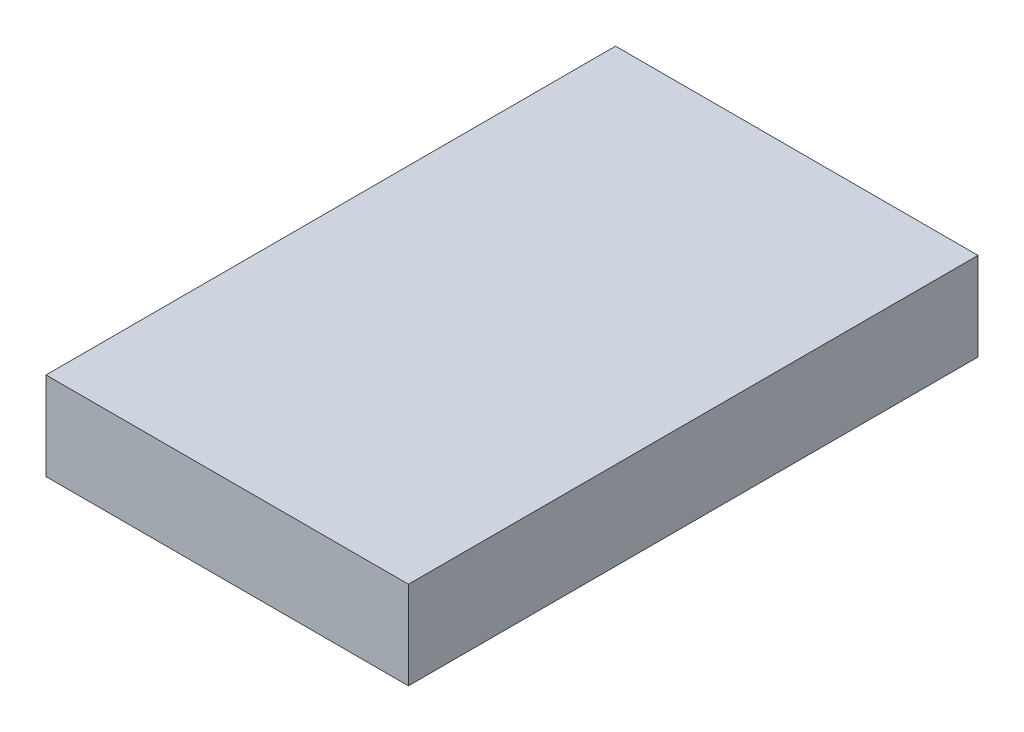
ISO-10303-21;
HEADER;
FILE_DESCRIPTION(('STEP AP214'),'2;1');
FILE_NAME('part.step','',(''),(''),'','','');
FILE_SCHEMA(('AUTOMOTIVE_DESIGN { 1 0 10303 214 1 1 1 1 }'));
ENDSEC;
DATA;
#1=APPLICATION_CONTEXT('core data for automotive mechanical design processes');
#2=APPLICATION_PROTOCOL_DEFINITION('international standard','automotive_design',2000,#1);
#3=PRODUCT_CONTEXT('',#1,'mechanical');
#4=PRODUCT('Part','Part','',(#3));
#5=PRODUCT_RELATED_PRODUCT_CATEGORY('part','',(#4));
#6=PRODUCT_DEFINITION_FORMATION('','',#4);
#7=PRODUCT_DEFINITION_CONTEXT('part definition',#1,'design');
#8=PRODUCT_DEFINITION('design','',#6,#7);
#9=PRODUCT_DEFINITION_SHAPE('','',#8);
#10=(LENGTH_UNIT() NAMED_UNIT(*) SI_UNIT(.MILLI.,.METRE.));
#11=(NAMED_UNIT(*) PLANE_ANGLE_UNIT() SI_UNIT($,.RADIAN.));
#12=(NAMED_UNIT(*) SI_UNIT($,.STERADIAN.) SOLID_ANGLE_UNIT());
#13=UNCERTAINTY_MEASURE_WITH_UNIT(LENGTH_MEASURE(1.E-05),#10,'distance_accuracy_value','');
#14=(GEOMETRIC_REPRESENTATION_CONTEXT(3) GLOBAL_UNCERTAINTY_ASSIGNED_CONTEXT((#13)) GLOBAL_UNIT_ASSIGNED_CONTEXT((#10,
#11,#12)) REPRESENTATION_CONTEXT('',''));
#15=CARTESIAN_POINT('',(0.,0.,0.));
#16=DIRECTION('',(0.,0.,1.));
#17=DIRECTION('',(1.,0.,0.));
#18=AXIS2_PLACEMENT_3D('',#15,#16,#17);
#19=CARTESIAN_POINT('',(70.,0.,-110.));
#20=DIRECTION('',(0.,0.,-1.));
#21=DIRECTION('',(-1.,0.,0.));
#22=AXIS2_PLACEMENT_3D('',#19,#20,#21);
#23=PLANE('',#22);
#24=DIRECTION('',(-1.,0.,0.));
#25=VECTOR('',#24,1.);
#26=CARTESIAN_POINT('',(70.,17.,-110.));
#27=LINE('',#26,#25);
#28=CARTESIAN_POINT('',(70.,17.,-110.));
#29=VERTEX_POINT('',#28);
#30=CARTESIAN_POINT('',(0.,17.,-110.));
#31=VERTEX_POINT('',#30);
#32=EDGE_CURVE('E96',#29,#31,#27,.T.);
#33=ORIENTED_EDGE('',*,*,#32,.F.);
#34=DIRECTION('',(0.,1.,0.));
#35=VECTOR('',#34,1.);
#36=CARTESIAN_POINT('',(70.,0.,-110.));
#37=LINE('',#36,#35);
#38=CARTESIAN_POINT('',(70.,0.,-110.));
#39=VERTEX_POINT('',#38);
#40=EDGE_CURVE('E11',#39,#29,#37,.T.);
#41=ORIENTED_EDGE('',*,*,#40,.F.);
#42=DIRECTION('',(-1.,0.,0.));
#43=VECTOR('',#42,1.);
#44=CARTESIAN_POINT('',(70.,0.,-110.));
#45=LINE('',#44,#43);
#46=CARTESIAN_POINT('',(0.,0.,-110.));
#47=VERTEX_POINT('',#46);
#48=EDGE_CURVE('E90',#39,#47,#45,.T.);
#49=ORIENTED_EDGE('',*,*,#48,.T.);
#50=DIRECTION('',(0.,1.,0.));
#51=VECTOR('',#50,1.);
#52=CARTESIAN_POINT('',(0.,0.,-110.));
#53=LINE('',#52,#51);
#54=EDGE_CURVE('E35',#47,#31,#53,.T.);
#55=ORIENTED_EDGE('',*,*,#54,.T.);
#56=EDGE_LOOP('',(#33,#41,#49,#55));
#57=FACE_BOUND('',#56,.T.);
#58=ADVANCED_FACE('F32',(#57),#23,.T.);
#59=CARTESIAN_POINT('',(70.,0.,0.));
#60=DIRECTION('',(1.,0.,0.));
#61=DIRECTION('',(0.,0.,-1.));
#62=AXIS2_PLACEMENT_3D('',#59,#60,#61);
#63=PLANE('',#62);
#64=DIRECTION('',(0.,0.,-1.));
#65=VECTOR('',#64,1.);
#66=CARTESIAN_POINT('',(70.,17.,0.));
#67=LINE('',#66,#65);
#68=CARTESIAN_POINT('',(70.,17.,0.));
#69=VERTEX_POINT('',#68);
#70=EDGE_CURVE('E92',#69,#29,#67,.T.);
#71=ORIENTED_EDGE('',*,*,#70,.F.);
#72=DIRECTION('',(0.,1.,0.));
#73=VECTOR('',#72,1.);
#74=CARTESIAN_POINT('',(70.,0.,0.));
#75=LINE('',#74,#73);
#76=CARTESIAN_POINT('',(70.,0.,0.));
#77=VERTEX_POINT('',#76);
#78=EDGE_CURVE('E41',#77,#69,#75,.T.);
#79=ORIENTED_EDGE('',*,*,#78,.F.);
#80=DIRECTION('',(0.,0.,-1.));
#81=VECTOR('',#80,1.);
#82=CARTESIAN_POINT('',(70.,0.,0.));
#83=LINE('',#82,#81);
#84=EDGE_CURVE('E87',#77,#39,#83,.T.);
#85=ORIENTED_EDGE('',*,*,#84,.T.);
#86=ORIENTED_EDGE('',*,*,#40,.T.);
#87=EDGE_LOOP('',(#71,#79,#85,#86));
#88=FACE_BOUND('',#87,.T.);
#89=ADVANCED_FACE('F106',(#88),#63,.T.);
#90=CARTESIAN_POINT('',(0.,0.,0.));
#91=DIRECTION('',(0.,0.,1.));
#92=DIRECTION('',(1.,0.,0.));
#93=AXIS2_PLACEMENT_3D('',#90,#91,#92);
#94=PLANE('',#93);
#95=DIRECTION('',(1.,0.,0.));
#96=VECTOR('',#95,1.);
#97=CARTESIAN_POINT('',(0.,17.,0.));
#98=LINE('',#97,#96);
#99=CARTESIAN_POINT('',(0.,17.,0.));
#100=VERTEX_POINT('',#99);
#101=EDGE_CURVE('E82',#100,#69,#98,.T.);
#102=ORIENTED_EDGE('',*,*,#101,.F.);
#103=DIRECTION('',(0.,1.,0.));
#104=VECTOR('',#103,1.);
#105=CARTESIAN_POINT('',(0.,0.,0.));
#106=LINE('',#105,#104);
#107=CARTESIAN_POINT('',(0.,0.,0.));
#108=VERTEX_POINT('',#107);
#109=EDGE_CURVE('E77',#108,#100,#106,.T.);
#110=ORIENTED_EDGE('',*,*,#109,.F.);
#111=DIRECTION('',(1.,0.,0.));
#112=VECTOR('',#111,1.);
#113=CARTESIAN_POINT('',(0.,0.,0.));
#114=LINE('',#113,#112);
#115=EDGE_CURVE('E80',#108,#77,#114,.T.);
#116=ORIENTED_EDGE('',*,*,#115,.T.);
#117=ORIENTED_EDGE('',*,*,#78,.T.);
#118=EDGE_LOOP('',(#102,#110,#116,#117));
#119=FACE_BOUND('',#118,.T.);
#120=ADVANCED_FACE('F79',(#119),#94,.T.);
#121=CARTESIAN_POINT('',(0.,0.,-110.));
#122=DIRECTION('',(-1.,0.,0.));
#123=DIRECTION('',(0.,0.,1.));
#124=AXIS2_PLACEMENT_3D('',#121,#122,#123);
#125=PLANE('',#124);
#126=DIRECTION('',(0.,0.,1.));
#127=VECTOR('',#126,1.);
#128=CARTESIAN_POINT('',(0.,17.,-110.));
#129=LINE('',#128,#127);
#130=EDGE_CURVE('E99',#31,#100,#129,.T.);
#131=ORIENTED_EDGE('',*,*,#130,.F.);
#132=ORIENTED_EDGE('',*,*,#54,.F.);
#133=DIRECTION('',(0.,0.,1.));
#134=VECTOR('',#133,1.);
#135=CARTESIAN_POINT('',(0.,0.,-110.));
#136=LINE('',#135,#134);
#137=EDGE_CURVE('E86',#47,#108,#136,.T.);
#138=ORIENTED_EDGE('',*,*,#137,.T.);
#139=ORIENTED_EDGE('',*,*,#109,.T.);
#140=EDGE_LOOP('',(#131,#132,#138,#139));
#141=FACE_BOUND('',#140,.T.);
#142=ADVANCED_FACE('F89',(#141),#125,.T.);
#143=CARTESIAN_POINT('',(0.,0.,0.));
#144=DIRECTION('',(0.,1.,0.));
#145=DIRECTION('',(0.,0.,1.));
#146=AXIS2_PLACEMENT_3D('',#143,#144,#145);
#147=PLANE('',#146);
#148=ORIENTED_EDGE('',*,*,#48,.F.);
#149=ORIENTED_EDGE('',*,*,#84,.F.);
#150=ORIENTED_EDGE('',*,*,#115,.F.);
#151=ORIENTED_EDGE('',*,*,#137,.F.);
#152=EDGE_LOOP('',(#148,#149,#150,#151));
#153=FACE_BOUND('',#152,.T.);
#154=ADVANCED_FACE('F85',(#153),#147,.F.);
#155=CARTESIAN_POINT('',(0.,17.,0.));
#156=DIRECTION('',(0.,1.,0.));
#157=DIRECTION('',(0.,0.,1.));
#158=AXIS2_PLACEMENT_3D('',#155,#156,#157);
#159=PLANE('',#158);
#160=ORIENTED_EDGE('',*,*,#32,.T.);
#161=ORIENTED_EDGE('',*,*,#130,.T.);
#162=ORIENTED_EDGE('',*,*,#101,.T.);
#163=ORIENTED_EDGE('',*,*,#70,.T.);
#164=EDGE_LOOP('',(#160,#161,#162,#163));
#165=FACE_BOUND('',#164,.T.);
#166=ADVANCED_FACE('F105',(#165),#159,.T.);
#167=CLOSED_SHELL('',(#58,#89,#120,#142,#154,#166));
#168=MANIFOLD_SOLID_BREP('B2',#167);
#169=ADVANCED_BREP_SHAPE_REPRESENTATION('',(#18,#168),#14);
#170=SHAPE_DEFINITION_REPRESENTATION(#9,#169);
ENDSEC;
END-ISO-10303-21;
